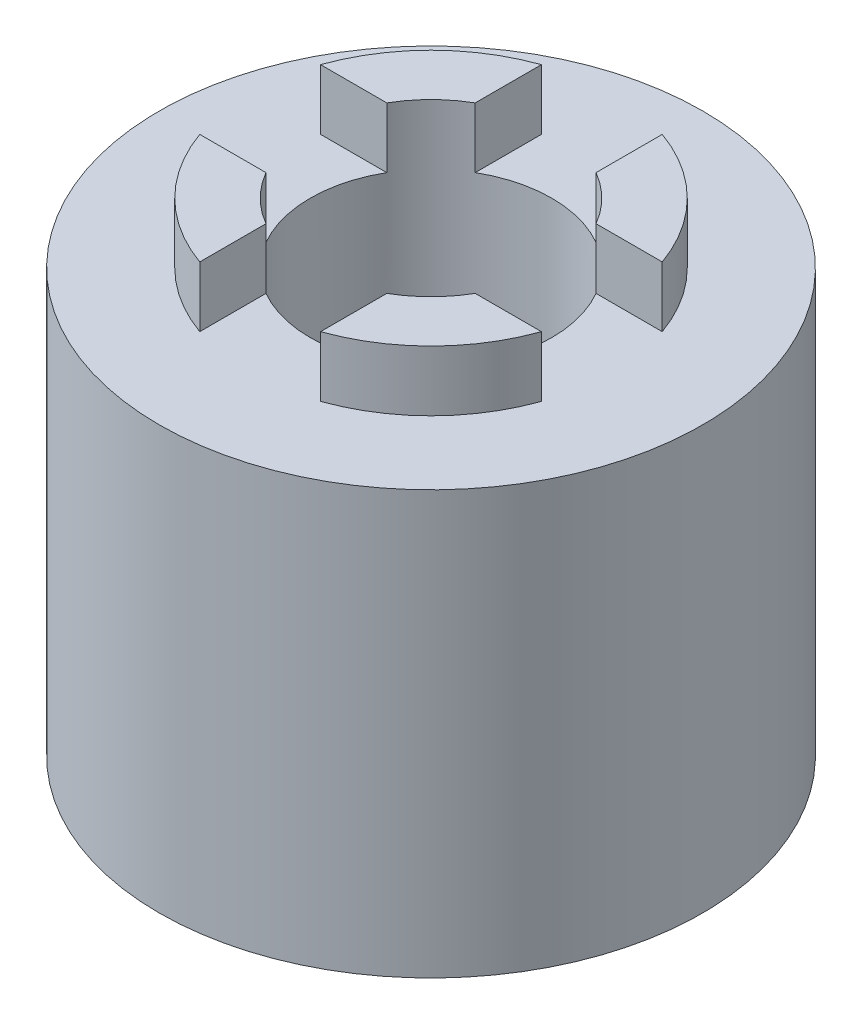
ISO-10303-21;
HEADER;
FILE_DESCRIPTION(('STEP AP214'),'2;1');
FILE_NAME('part.step','',(''),(''),'','','');
FILE_SCHEMA(('AUTOMOTIVE_DESIGN { 1 0 10303 214 1 1 1 1 }'));
ENDSEC;
DATA;
#1=APPLICATION_CONTEXT('core data for automotive mechanical design processes');
#2=APPLICATION_PROTOCOL_DEFINITION('international standard','automotive_design',2000,#1);
#3=PRODUCT_CONTEXT('',#1,'mechanical');
#4=PRODUCT('Part','Part','',(#3));
#5=PRODUCT_RELATED_PRODUCT_CATEGORY('part','',(#4));
#6=PRODUCT_DEFINITION_FORMATION('','',#4);
#7=PRODUCT_DEFINITION_CONTEXT('part definition',#1,'design');
#8=PRODUCT_DEFINITION('design','',#6,#7);
#9=PRODUCT_DEFINITION_SHAPE('','',#8);
#10=(LENGTH_UNIT() NAMED_UNIT(*) SI_UNIT(.MILLI.,.METRE.));
#11=(NAMED_UNIT(*) PLANE_ANGLE_UNIT() SI_UNIT($,.RADIAN.));
#12=(NAMED_UNIT(*) SI_UNIT($,.STERADIAN.) SOLID_ANGLE_UNIT());
#13=UNCERTAINTY_MEASURE_WITH_UNIT(LENGTH_MEASURE(1.E-05),#10,'distance_accuracy_value','');
#14=(GEOMETRIC_REPRESENTATION_CONTEXT(3) GLOBAL_UNCERTAINTY_ASSIGNED_CONTEXT((#13)) GLOBAL_UNIT_ASSIGNED_CONTEXT((#10,
#11,#12)) REPRESENTATION_CONTEXT('',''));
#15=CARTESIAN_POINT('',(0.,0.,0.));
#16=DIRECTION('',(0.,0.,1.));
#17=DIRECTION('',(1.,0.,0.));
#18=AXIS2_PLACEMENT_3D('',#15,#16,#17);
#19=CARTESIAN_POINT('',(0.,50.8,0.));
#20=DIRECTION('',(0.,1.,0.));
#21=DIRECTION('',(0.,0.,1.));
#22=AXIS2_PLACEMENT_3D('',#19,#20,#21);
#23=PLANE('',#22);
#24=DIRECTION('',(0.,0.,1.));
#25=VECTOR('',#24,1.);
#26=CARTESIAN_POINT('',(-6.35000000000014,50.8,-38.0999999999998));
#27=LINE('',#26,#25);
#28=CARTESIAN_POINT('',(-6.35000000000007,50.8,-17.9605122421383));
#29=VERTEX_POINT('',#28);
#30=CARTESIAN_POINT('',(-6.35000000000005,50.8,-10.9985226280623));
#31=VERTEX_POINT('',#30);
#32=EDGE_CURVE('E184',#29,#31,#27,.T.);
#33=ORIENTED_EDGE('',*,*,#32,.F.);
#34=CARTESIAN_POINT('',(0.,50.8,0.));
#35=DIRECTION('',(0.,1.,0.));
#36=DIRECTION('',(0.,0.,1.));
#37=AXIS2_PLACEMENT_3D('',#34,#35,#36);
#38=CIRCLE('',#37,19.05);
#39=CARTESIAN_POINT('',(-17.9605122421383,50.8,-6.35));
#40=VERTEX_POINT('',#39);
#41=EDGE_CURVE('E63',#29,#40,#38,.T.);
#42=ORIENTED_EDGE('',*,*,#41,.T.);
#43=DIRECTION('',(-1.,0.,0.));
#44=VECTOR('',#43,1.);
#45=CARTESIAN_POINT('',(38.0999999999998,50.8,-6.35000000000001));
#46=LINE('',#45,#44);
#47=CARTESIAN_POINT('',(-10.9985226280624,50.8,-6.35));
#48=VERTEX_POINT('',#47);
#49=EDGE_CURVE('E207',#48,#40,#46,.T.);
#50=ORIENTED_EDGE('',*,*,#49,.F.);
#51=CARTESIAN_POINT('',(0.,50.8,0.));
#52=DIRECTION('',(0.,1.,0.));
#53=DIRECTION('',(0.,0.,1.));
#54=AXIS2_PLACEMENT_3D('',#51,#52,#53);
#55=CIRCLE('',#54,12.7);
#56=EDGE_CURVE('E217',#31,#48,#55,.T.);
#57=ORIENTED_EDGE('',*,*,#56,.F.);
#58=EDGE_LOOP('',(#33,#42,#50,#57));
#59=FACE_BOUND('',#58,.T.);
#60=ADVANCED_FACE('F39',(#59),#23,.T.);
#61=DIRECTION('',(1.,0.,0.));
#62=VECTOR('',#61,1.);
#63=CARTESIAN_POINT('',(38.0999999999998,50.8,6.34999999999999));
#64=LINE('',#63,#62);
#65=CARTESIAN_POINT('',(-17.9605122421383,50.8,6.35));
#66=VERTEX_POINT('',#65);
#67=CARTESIAN_POINT('',(-10.9985226280624,50.8,6.35));
#68=VERTEX_POINT('',#67);
#69=EDGE_CURVE('E206',#66,#68,#64,.T.);
#70=ORIENTED_EDGE('',*,*,#69,.F.);
#71=CARTESIAN_POINT('',(-6.34999999999994,50.8,17.9605122421383));
#72=VERTEX_POINT('',#71);
#73=EDGE_CURVE('E261',#66,#72,#38,.T.);
#74=ORIENTED_EDGE('',*,*,#73,.T.);
#75=CARTESIAN_POINT('',(-6.34999999999996,50.8,10.9985226280624));
#76=VERTEX_POINT('',#75);
#77=EDGE_CURVE('E193',#76,#72,#27,.T.);
#78=ORIENTED_EDGE('',*,*,#77,.F.);
#79=EDGE_CURVE('E214',#68,#76,#55,.T.);
#80=ORIENTED_EDGE('',*,*,#79,.F.);
#81=EDGE_LOOP('',(#70,#74,#78,#80));
#82=FACE_BOUND('',#81,.T.);
#83=ADVANCED_FACE('F259',(#82),#23,.T.);
#84=CARTESIAN_POINT('',(17.9605122421383,50.8,-6.35000000000001));
#85=VERTEX_POINT('',#84);
#86=CARTESIAN_POINT('',(10.9985226280624,50.8,-6.35000000000001));
#87=VERTEX_POINT('',#86);
#88=EDGE_CURVE('E198',#85,#87,#46,.T.);
#89=ORIENTED_EDGE('',*,*,#88,.F.);
#90=CARTESIAN_POINT('',(6.34999999999993,50.8,-17.9605122421383));
#91=VERTEX_POINT('',#90);
#92=EDGE_CURVE('E265',#85,#91,#38,.T.);
#93=ORIENTED_EDGE('',*,*,#92,.T.);
#94=DIRECTION('',(0.,0.,-1.));
#95=VECTOR('',#94,1.);
#96=CARTESIAN_POINT('',(6.34999999999985,50.8,-38.0999999999999));
#97=LINE('',#96,#95);
#98=CARTESIAN_POINT('',(6.34999999999995,50.8,-10.9985226280624));
#99=VERTEX_POINT('',#98);
#100=EDGE_CURVE('E189',#99,#91,#97,.T.);
#101=ORIENTED_EDGE('',*,*,#100,.F.);
#102=EDGE_CURVE('E218',#87,#99,#55,.T.);
#103=ORIENTED_EDGE('',*,*,#102,.F.);
#104=EDGE_LOOP('',(#89,#93,#101,#103));
#105=FACE_BOUND('',#104,.T.);
#106=ADVANCED_FACE('F273',(#105),#23,.T.);
#107=CARTESIAN_POINT('',(6.35000000000006,50.8,17.9605122421383));
#108=VERTEX_POINT('',#107);
#109=CARTESIAN_POINT('',(6.35000000000004,50.8,10.9985226280624));
#110=VERTEX_POINT('',#109);
#111=EDGE_CURVE('E192',#108,#110,#97,.T.);
#112=ORIENTED_EDGE('',*,*,#111,.F.);
#113=CARTESIAN_POINT('',(17.9605122421383,50.8,6.34999999999999));
#114=VERTEX_POINT('',#113);
#115=EDGE_CURVE('E157',#108,#114,#38,.T.);
#116=ORIENTED_EDGE('',*,*,#115,.T.);
#117=CARTESIAN_POINT('',(10.9985226280624,50.8,6.34999999999999));
#118=VERTEX_POINT('',#117);
#119=EDGE_CURVE('E203',#118,#114,#64,.T.);
#120=ORIENTED_EDGE('',*,*,#119,.F.);
#121=EDGE_CURVE('E213',#110,#118,#55,.T.);
#122=ORIENTED_EDGE('',*,*,#121,.F.);
#123=EDGE_LOOP('',(#112,#116,#120,#122));
#124=FACE_BOUND('',#123,.T.);
#125=ADVANCED_FACE('F292',(#124),#23,.T.);
#126=CARTESIAN_POINT('',(0.,50.8,0.));
#127=DIRECTION('',(0.,-1.,0.));
#128=DIRECTION('',(0.,0.,-1.));
#129=AXIS2_PLACEMENT_3D('',#126,#127,#128);
#130=CYLINDRICAL_SURFACE('',#129,28.575);
#131=CARTESIAN_POINT('',(0.,0.,0.));
#132=DIRECTION('',(0.,1.,0.));
#133=DIRECTION('',(0.,0.,1.));
#134=AXIS2_PLACEMENT_3D('',#131,#132,#133);
#135=CIRCLE('',#134,28.575);
#136=CARTESIAN_POINT('',(0.,0.,28.575));
#137=VERTEX_POINT('',#136);
#138=EDGE_CURVE('E219',#137,#137,#135,.T.);
#139=ORIENTED_EDGE('',*,*,#138,.T.);
#140=EDGE_LOOP('',(#139));
#141=FACE_BOUND('',#140,.T.);
#142=CARTESIAN_POINT('',(0.,44.45,0.));
#143=DIRECTION('',(0.,-1.,0.));
#144=DIRECTION('',(0.,0.,-1.));
#145=AXIS2_PLACEMENT_3D('',#142,#143,#144);
#146=CIRCLE('',#145,28.575);
#147=CARTESIAN_POINT('',(0.,44.45,-28.575));
#148=VERTEX_POINT('',#147);
#149=EDGE_CURVE('E210',#148,#148,#146,.T.);
#150=ORIENTED_EDGE('',*,*,#149,.T.);
#151=EDGE_LOOP('',(#150));
#152=FACE_BOUND('',#151,.T.);
#153=ADVANCED_FACE('F41',(#141,#152),#130,.T.);
#154=CARTESIAN_POINT('',(38.0999999999998,44.45,6.34999999999999));
#155=DIRECTION('',(0.,0.,1.));
#156=DIRECTION('',(1.,0.,0.));
#157=AXIS2_PLACEMENT_3D('',#154,#155,#156);
#158=PLANE('',#157);
#159=DIRECTION('',(0.,1.,0.));
#160=VECTOR('',#159,1.);
#161=CARTESIAN_POINT('',(-17.9605122421383,44.45,6.35));
#162=LINE('',#161,#160);
#163=CARTESIAN_POINT('',(-17.9605122421383,44.45,6.35));
#164=VERTEX_POINT('',#163);
#165=EDGE_CURVE('E324',#66,#164,#162,.F.);
#166=ORIENTED_EDGE('',*,*,#165,.F.);
#167=ORIENTED_EDGE('',*,*,#69,.T.);
#168=DIRECTION('',(0.,-1.,0.));
#169=VECTOR('',#168,1.);
#170=CARTESIAN_POINT('',(-10.9985226280624,50.8,6.35));
#171=LINE('',#170,#169);
#172=CARTESIAN_POINT('',(-10.9985226280624,44.45,6.35));
#173=VERTEX_POINT('',#172);
#174=EDGE_CURVE('E224',#68,#173,#171,.T.);
#175=ORIENTED_EDGE('',*,*,#174,.T.);
#176=DIRECTION('',(1.,0.,0.));
#177=VECTOR('',#176,1.);
#178=CARTESIAN_POINT('',(38.0999999999998,44.45,6.34999999999999));
#179=LINE('',#178,#177);
#180=EDGE_CURVE('E197',#164,#173,#179,.T.);
#181=ORIENTED_EDGE('',*,*,#180,.F.);
#182=EDGE_LOOP('',(#166,#167,#175,#181));
#183=FACE_BOUND('',#182,.T.);
#184=ADVANCED_FACE('F299',(#183),#158,.F.);
#185=CARTESIAN_POINT('',(38.0999999999998,44.45,-6.35000000000001));
#186=DIRECTION('',(0.,0.,-1.));
#187=DIRECTION('',(-1.,0.,0.));
#188=AXIS2_PLACEMENT_3D('',#185,#186,#187);
#189=PLANE('',#188);
#190=DIRECTION('',(0.,1.,0.));
#191=VECTOR('',#190,1.);
#192=CARTESIAN_POINT('',(-17.9605122421383,44.45,-6.35));
#193=LINE('',#192,#191);
#194=CARTESIAN_POINT('',(-17.9605122421383,44.45,-6.35));
#195=VERTEX_POINT('',#194);
#196=EDGE_CURVE('E322',#195,#40,#193,.T.);
#197=ORIENTED_EDGE('',*,*,#196,.F.);
#198=DIRECTION('',(-1.,0.,0.));
#199=VECTOR('',#198,1.);
#200=CARTESIAN_POINT('',(38.0999999999998,44.45,-6.35000000000001));
#201=LINE('',#200,#199);
#202=CARTESIAN_POINT('',(-10.9985226280624,44.45,-6.35));
#203=VERTEX_POINT('',#202);
#204=EDGE_CURVE('E199',#203,#195,#201,.T.);
#205=ORIENTED_EDGE('',*,*,#204,.F.);
#206=DIRECTION('',(0.,-1.,0.));
#207=VECTOR('',#206,1.);
#208=CARTESIAN_POINT('',(-10.9985226280624,50.8,-6.35));
#209=LINE('',#208,#207);
#210=EDGE_CURVE('E228',#203,#48,#209,.F.);
#211=ORIENTED_EDGE('',*,*,#210,.T.);
#212=ORIENTED_EDGE('',*,*,#49,.T.);
#213=EDGE_LOOP('',(#197,#205,#211,#212));
#214=FACE_BOUND('',#213,.T.);
#215=ADVANCED_FACE('F352',(#214),#189,.F.);
#216=DIRECTION('',(0.,1.,0.));
#217=VECTOR('',#216,1.);
#218=CARTESIAN_POINT('',(17.9605122421383,44.45,-6.35000000000001));
#219=LINE('',#218,#217);
#220=CARTESIAN_POINT('',(17.9605122421383,44.45,-6.35000000000001));
#221=VERTEX_POINT('',#220);
#222=EDGE_CURVE('E320',#85,#221,#219,.F.);
#223=ORIENTED_EDGE('',*,*,#222,.F.);
#224=ORIENTED_EDGE('',*,*,#88,.T.);
#225=DIRECTION('',(0.,-1.,0.));
#226=VECTOR('',#225,1.);
#227=CARTESIAN_POINT('',(10.9985226280624,50.8,-6.35000000000001));
#228=LINE('',#227,#226);
#229=CARTESIAN_POINT('',(10.9985226280624,44.45,-6.35000000000001));
#230=VERTEX_POINT('',#229);
#231=EDGE_CURVE('E234',#87,#230,#228,.T.);
#232=ORIENTED_EDGE('',*,*,#231,.T.);
#233=EDGE_CURVE('E202',#221,#230,#201,.T.);
#234=ORIENTED_EDGE('',*,*,#233,.F.);
#235=EDGE_LOOP('',(#223,#224,#232,#234));
#236=FACE_BOUND('',#235,.T.);
#237=ADVANCED_FACE('F355',(#236),#189,.F.);
#238=DIRECTION('',(0.,1.,0.));
#239=VECTOR('',#238,1.);
#240=CARTESIAN_POINT('',(17.9605122421383,44.45,6.34999999999999));
#241=LINE('',#240,#239);
#242=CARTESIAN_POINT('',(17.9605122421383,44.45,6.34999999999999));
#243=VERTEX_POINT('',#242);
#244=EDGE_CURVE('E315',#243,#114,#241,.T.);
#245=ORIENTED_EDGE('',*,*,#244,.F.);
#246=CARTESIAN_POINT('',(10.9985226280624,44.45,6.34999999999999));
#247=VERTEX_POINT('',#246);
#248=EDGE_CURVE('E171',#247,#243,#179,.T.);
#249=ORIENTED_EDGE('',*,*,#248,.F.);
#250=DIRECTION('',(0.,-1.,0.));
#251=VECTOR('',#250,1.);
#252=CARTESIAN_POINT('',(10.9985226280624,50.8,6.34999999999999));
#253=LINE('',#252,#251);
#254=EDGE_CURVE('E231',#247,#118,#253,.F.);
#255=ORIENTED_EDGE('',*,*,#254,.T.);
#256=ORIENTED_EDGE('',*,*,#119,.T.);
#257=EDGE_LOOP('',(#245,#249,#255,#256));
#258=FACE_BOUND('',#257,.T.);
#259=ADVANCED_FACE('F291',(#258),#158,.F.);
#260=CARTESIAN_POINT('',(6.34999999999985,44.45,-38.0999999999999));
#261=DIRECTION('',(1.,0.,0.));
#262=DIRECTION('',(0.,0.,-1.));
#263=AXIS2_PLACEMENT_3D('',#260,#261,#262);
#264=PLANE('',#263);
#265=DIRECTION('',(0.,1.,0.));
#266=VECTOR('',#265,1.);
#267=CARTESIAN_POINT('',(6.34999999999993,44.45,-17.9605122421383));
#268=LINE('',#267,#266);
#269=CARTESIAN_POINT('',(6.34999999999993,44.45,-17.9605122421383));
#270=VERTEX_POINT('',#269);
#271=EDGE_CURVE('E280',#270,#91,#268,.T.);
#272=ORIENTED_EDGE('',*,*,#271,.F.);
#273=DIRECTION('',(0.,0.,-1.));
#274=VECTOR('',#273,1.);
#275=CARTESIAN_POINT('',(6.34999999999985,44.45,-38.0999999999999));
#276=LINE('',#275,#274);
#277=CARTESIAN_POINT('',(6.34999999999995,44.45,-10.9985226280624));
#278=VERTEX_POINT('',#277);
#279=EDGE_CURVE('E178',#278,#270,#276,.T.);
#280=ORIENTED_EDGE('',*,*,#279,.F.);
#281=DIRECTION('',(0.,-1.,0.));
#282=VECTOR('',#281,1.);
#283=CARTESIAN_POINT('',(6.34999999999995,50.8,-10.9985226280624));
#284=LINE('',#283,#282);
#285=EDGE_CURVE('E239',#278,#99,#284,.F.);
#286=ORIENTED_EDGE('',*,*,#285,.T.);
#287=ORIENTED_EDGE('',*,*,#100,.T.);
#288=EDGE_LOOP('',(#272,#280,#286,#287));
#289=FACE_BOUND('',#288,.T.);
#290=ADVANCED_FACE('F278',(#289),#264,.F.);
#291=CARTESIAN_POINT('',(-6.35000000000014,44.45,-38.0999999999998));
#292=DIRECTION('',(-1.,0.,0.));
#293=DIRECTION('',(0.,0.,1.));
#294=AXIS2_PLACEMENT_3D('',#291,#292,#293);
#295=PLANE('',#294);
#296=DIRECTION('',(0.,1.,0.));
#297=VECTOR('',#296,1.);
#298=CARTESIAN_POINT('',(-6.35000000000007,44.45,-17.9605122421383));
#299=LINE('',#298,#297);
#300=CARTESIAN_POINT('',(-6.35000000000007,44.45,-17.9605122421383));
#301=VERTEX_POINT('',#300);
#302=EDGE_CURVE('E312',#29,#301,#299,.F.);
#303=ORIENTED_EDGE('',*,*,#302,.F.);
#304=ORIENTED_EDGE('',*,*,#32,.T.);
#305=DIRECTION('',(0.,-1.,0.));
#306=VECTOR('',#305,1.);
#307=CARTESIAN_POINT('',(-6.35000000000005,50.8,-10.9985226280623));
#308=LINE('',#307,#306);
#309=CARTESIAN_POINT('',(-6.35000000000005,44.45,-10.9985226280623));
#310=VERTEX_POINT('',#309);
#311=EDGE_CURVE('E242',#31,#310,#308,.T.);
#312=ORIENTED_EDGE('',*,*,#311,.T.);
#313=DIRECTION('',(0.,0.,1.));
#314=VECTOR('',#313,1.);
#315=CARTESIAN_POINT('',(-6.35000000000014,44.45,-38.0999999999998));
#316=LINE('',#315,#314);
#317=EDGE_CURVE('E181',#301,#310,#316,.T.);
#318=ORIENTED_EDGE('',*,*,#317,.F.);
#319=EDGE_LOOP('',(#303,#304,#312,#318));
#320=FACE_BOUND('',#319,.T.);
#321=ADVANCED_FACE('F310',(#320),#295,.F.);
#322=DIRECTION('',(0.,1.,0.));
#323=VECTOR('',#322,1.);
#324=CARTESIAN_POINT('',(-6.34999999999994,44.45,17.9605122421383));
#325=LINE('',#324,#323);
#326=CARTESIAN_POINT('',(-6.34999999999994,44.45,17.9605122421383));
#327=VERTEX_POINT('',#326);
#328=EDGE_CURVE('E161',#327,#72,#325,.T.);
#329=ORIENTED_EDGE('',*,*,#328,.F.);
#330=CARTESIAN_POINT('',(-6.34999999999996,44.45,10.9985226280624));
#331=VERTEX_POINT('',#330);
#332=EDGE_CURVE('E177',#331,#327,#316,.T.);
#333=ORIENTED_EDGE('',*,*,#332,.F.);
#334=DIRECTION('',(0.,-1.,0.));
#335=VECTOR('',#334,1.);
#336=CARTESIAN_POINT('',(-6.34999999999996,50.8,10.9985226280624));
#337=LINE('',#336,#335);
#338=EDGE_CURVE('E12',#331,#76,#337,.F.);
#339=ORIENTED_EDGE('',*,*,#338,.T.);
#340=ORIENTED_EDGE('',*,*,#77,.T.);
#341=EDGE_LOOP('',(#329,#333,#339,#340));
#342=FACE_BOUND('',#341,.T.);
#343=ADVANCED_FACE('F250',(#342),#295,.F.);
#344=DIRECTION('',(0.,1.,0.));
#345=VECTOR('',#344,1.);
#346=CARTESIAN_POINT('',(6.35000000000006,44.45,17.9605122421383));
#347=LINE('',#346,#345);
#348=CARTESIAN_POINT('',(6.35000000000006,44.45,17.9605122421383));
#349=VERTEX_POINT('',#348);
#350=EDGE_CURVE('E151',#108,#349,#347,.F.);
#351=ORIENTED_EDGE('',*,*,#350,.F.);
#352=ORIENTED_EDGE('',*,*,#111,.T.);
#353=DIRECTION('',(0.,-1.,0.));
#354=VECTOR('',#353,1.);
#355=CARTESIAN_POINT('',(6.35000000000004,50.8,10.9985226280624));
#356=LINE('',#355,#354);
#357=CARTESIAN_POINT('',(6.35000000000004,44.45,10.9985226280624));
#358=VERTEX_POINT('',#357);
#359=EDGE_CURVE('E48',#110,#358,#356,.T.);
#360=ORIENTED_EDGE('',*,*,#359,.T.);
#361=EDGE_CURVE('E168',#349,#358,#276,.T.);
#362=ORIENTED_EDGE('',*,*,#361,.F.);
#363=EDGE_LOOP('',(#351,#352,#360,#362));
#364=FACE_BOUND('',#363,.T.);
#365=ADVANCED_FACE('F174',(#364),#264,.F.);
#366=CARTESIAN_POINT('',(0.,50.8,0.));
#367=DIRECTION('',(0.,-1.,0.));
#368=DIRECTION('',(0.,0.,-1.));
#369=AXIS2_PLACEMENT_3D('',#366,#367,#368);
#370=CYLINDRICAL_SURFACE('',#369,12.7);
#371=ORIENTED_EDGE('',*,*,#338,.F.);
#372=CARTESIAN_POINT('',(0.,44.45,0.));
#373=DIRECTION('',(0.,-1.,0.));
#374=DIRECTION('',(0.,0.,-1.));
#375=AXIS2_PLACEMENT_3D('',#372,#373,#374);
#376=CIRCLE('',#375,12.7);
#377=EDGE_CURVE('E240',#358,#331,#376,.T.);
#378=ORIENTED_EDGE('',*,*,#377,.F.);
#379=ORIENTED_EDGE('',*,*,#359,.F.);
#380=ORIENTED_EDGE('',*,*,#121,.T.);
#381=ORIENTED_EDGE('',*,*,#254,.F.);
#382=CARTESIAN_POINT('',(0.,44.45,0.));
#383=DIRECTION('',(0.,-1.,0.));
#384=DIRECTION('',(0.,0.,-1.));
#385=AXIS2_PLACEMENT_3D('',#382,#383,#384);
#386=CIRCLE('',#385,12.7);
#387=EDGE_CURVE('E225',#230,#247,#386,.T.);
#388=ORIENTED_EDGE('',*,*,#387,.F.);
#389=ORIENTED_EDGE('',*,*,#231,.F.);
#390=ORIENTED_EDGE('',*,*,#102,.T.);
#391=ORIENTED_EDGE('',*,*,#285,.F.);
#392=EDGE_CURVE('E237',#310,#278,#376,.T.);
#393=ORIENTED_EDGE('',*,*,#392,.F.);
#394=ORIENTED_EDGE('',*,*,#311,.F.);
#395=ORIENTED_EDGE('',*,*,#56,.T.);
#396=ORIENTED_EDGE('',*,*,#210,.F.);
#397=EDGE_CURVE('E222',#173,#203,#386,.T.);
#398=ORIENTED_EDGE('',*,*,#397,.F.);
#399=ORIENTED_EDGE('',*,*,#174,.F.);
#400=ORIENTED_EDGE('',*,*,#79,.T.);
#401=EDGE_LOOP('',(#371,#378,#379,#380,#381,#388,#389,#390,#391,#393,#394,#395,#396,#398,#399,#400));
#402=FACE_BOUND('',#401,.T.);
#403=CARTESIAN_POINT('',(0.,25.4,0.));
#404=DIRECTION('',(0.,-1.,0.));
#405=DIRECTION('',(0.,0.,-1.));
#406=AXIS2_PLACEMENT_3D('',#403,#404,#405);
#407=CIRCLE('',#406,12.7);
#408=CARTESIAN_POINT('',(0.,25.4,-12.7));
#409=VERTEX_POINT('',#408);
#410=EDGE_CURVE('E43',#409,#409,#407,.T.);
#411=ORIENTED_EDGE('',*,*,#410,.T.);
#412=EDGE_LOOP('',(#411));
#413=FACE_BOUND('',#412,.T.);
#414=ADVANCED_FACE('F252',(#402,#413),#370,.F.);
#415=CARTESIAN_POINT('',(0.,0.,0.));
#416=DIRECTION('',(0.,1.,0.));
#417=DIRECTION('',(0.,0.,1.));
#418=AXIS2_PLACEMENT_3D('',#415,#416,#417);
#419=PLANE('',#418);
#420=CARTESIAN_POINT('',(0.,0.,0.));
#421=DIRECTION('',(0.,-1.,0.));
#422=DIRECTION('',(0.,0.,-1.));
#423=AXIS2_PLACEMENT_3D('',#420,#421,#422);
#424=CIRCLE('',#423,22.225);
#425=CARTESIAN_POINT('',(0.,0.,-22.225));
#426=VERTEX_POINT('',#425);
#427=EDGE_CURVE('E186',#426,#426,#424,.T.);
#428=ORIENTED_EDGE('',*,*,#427,.F.);
#429=EDGE_LOOP('',(#428));
#430=FACE_BOUND('',#429,.T.);
#431=ORIENTED_EDGE('',*,*,#138,.F.);
#432=EDGE_LOOP('',(#431));
#433=FACE_BOUND('',#432,.T.);
#434=ADVANCED_FACE('F335',(#430,#433),#419,.F.);
#435=CARTESIAN_POINT('',(0.,44.45,0.));
#436=DIRECTION('',(0.,-1.,0.));
#437=DIRECTION('',(0.,0.,-1.));
#438=AXIS2_PLACEMENT_3D('',#435,#436,#437);
#439=PLANE('',#438);
#440=CARTESIAN_POINT('',(0.,44.45,0.));
#441=DIRECTION('',(0.,1.,0.));
#442=DIRECTION('',(0.,0.,1.));
#443=AXIS2_PLACEMENT_3D('',#440,#441,#442);
#444=CIRCLE('',#443,19.05);
#445=EDGE_CURVE('E173',#164,#327,#444,.T.);
#446=ORIENTED_EDGE('',*,*,#445,.F.);
#447=ORIENTED_EDGE('',*,*,#180,.T.);
#448=ORIENTED_EDGE('',*,*,#397,.T.);
#449=ORIENTED_EDGE('',*,*,#204,.T.);
#450=EDGE_CURVE('E268',#301,#195,#444,.T.);
#451=ORIENTED_EDGE('',*,*,#450,.F.);
#452=ORIENTED_EDGE('',*,*,#317,.T.);
#453=ORIENTED_EDGE('',*,*,#392,.T.);
#454=ORIENTED_EDGE('',*,*,#279,.T.);
#455=EDGE_CURVE('E55',#221,#270,#444,.T.);
#456=ORIENTED_EDGE('',*,*,#455,.F.);
#457=ORIENTED_EDGE('',*,*,#233,.T.);
#458=ORIENTED_EDGE('',*,*,#387,.T.);
#459=ORIENTED_EDGE('',*,*,#248,.T.);
#460=EDGE_CURVE('E154',#349,#243,#444,.T.);
#461=ORIENTED_EDGE('',*,*,#460,.F.);
#462=ORIENTED_EDGE('',*,*,#361,.T.);
#463=ORIENTED_EDGE('',*,*,#377,.T.);
#464=ORIENTED_EDGE('',*,*,#332,.T.);
#465=EDGE_LOOP('',(#446,#447,#448,#449,#451,#452,#453,#454,#456,#457,#458,#459,#461,#462,#463,#464));
#466=FACE_BOUND('',#465,.T.);
#467=ORIENTED_EDGE('',*,*,#149,.F.);
#468=EDGE_LOOP('',(#467));
#469=FACE_BOUND('',#468,.T.);
#470=ADVANCED_FACE('F166',(#466,#469),#439,.F.);
#471=CARTESIAN_POINT('',(0.,25.4,0.));
#472=DIRECTION('',(0.,-1.,0.));
#473=DIRECTION('',(0.,0.,-1.));
#474=AXIS2_PLACEMENT_3D('',#471,#472,#473);
#475=CYLINDRICAL_SURFACE('',#474,22.225);
#476=CARTESIAN_POINT('',(0.,25.4,0.));
#477=DIRECTION('',(0.,-1.,0.));
#478=DIRECTION('',(0.,0.,-1.));
#479=AXIS2_PLACEMENT_3D('',#476,#477,#478);
#480=CIRCLE('',#479,22.225);
#481=CARTESIAN_POINT('',(0.,25.4,-22.225));
#482=VERTEX_POINT('',#481);
#483=EDGE_CURVE('E325',#482,#482,#480,.T.);
#484=CARTESIAN_POINT('',(0.,25.4,-22.225));
#485=CARTESIAN_POINT('',(0.,25.1354166666667,-22.225));
#486=CARTESIAN_POINT('',(0.,24.8708333333334,-22.225));
#487=CARTESIAN_POINT('',(0.,24.3416666666667,-22.225));
#488=CARTESIAN_POINT('',(0.,24.0770833333334,-22.225));
#489=CARTESIAN_POINT('',(0.,23.5479166666667,-22.225));
#490=CARTESIAN_POINT('',(0.,23.2833333333334,-22.225));
#491=CARTESIAN_POINT('',(0.,22.7541666666667,-22.225));
#492=CARTESIAN_POINT('',(0.,22.4895833333334,-22.225));
#493=CARTESIAN_POINT('',(0.,21.9604166666667,-22.225));
#494=CARTESIAN_POINT('',(0.,21.6958333333334,-22.225));
#495=CARTESIAN_POINT('',(0.,21.1666666666667,-22.225));
#496=CARTESIAN_POINT('',(0.,20.9020833333334,-22.225));
#497=CARTESIAN_POINT('',(0.,20.3729166666667,-22.225));
#498=CARTESIAN_POINT('',(0.,20.1083333333334,-22.225));
#499=CARTESIAN_POINT('',(0.,19.5791666666667,-22.225));
#500=CARTESIAN_POINT('',(0.,19.3145833333334,-22.225));
#501=CARTESIAN_POINT('',(0.,18.7854166666667,-22.225));
#502=CARTESIAN_POINT('',(0.,18.5208333333334,-22.225));
#503=CARTESIAN_POINT('',(0.,17.9916666666667,-22.225));
#504=CARTESIAN_POINT('',(0.,17.7270833333334,-22.225));
#505=CARTESIAN_POINT('',(0.,17.1979166666667,-22.225));
#506=CARTESIAN_POINT('',(0.,16.9333333333334,-22.225));
#507=CARTESIAN_POINT('',(0.,16.4041666666667,-22.225));
#508=CARTESIAN_POINT('',(0.,16.1395833333334,-22.225));
#509=CARTESIAN_POINT('',(0.,15.6104166666667,-22.225));
#510=CARTESIAN_POINT('',(0.,15.3458333333334,-22.225));
#511=CARTESIAN_POINT('',(0.,14.8166666666667,-22.225));
#512=CARTESIAN_POINT('',(0.,14.5520833333334,-22.225));
#513=CARTESIAN_POINT('',(0.,14.0229166666667,-22.225));
#514=CARTESIAN_POINT('',(0.,13.7583333333334,-22.225));
#515=CARTESIAN_POINT('',(0.,13.2291666666667,-22.225));
#516=CARTESIAN_POINT('',(0.,12.9645833333334,-22.225));
#517=CARTESIAN_POINT('',(0.,12.4354166666667,-22.225));
#518=CARTESIAN_POINT('',(0.,12.1708333333334,-22.225));
#519=CARTESIAN_POINT('',(0.,11.6416666666667,-22.225));
#520=CARTESIAN_POINT('',(0.,11.3770833333334,-22.225));
#521=CARTESIAN_POINT('',(0.,10.8479166666667,-22.225));
#522=CARTESIAN_POINT('',(0.,10.5833333333334,-22.225));
#523=CARTESIAN_POINT('',(0.,10.0541666666667,-22.225));
#524=CARTESIAN_POINT('',(0.,9.78958333333335,-22.225));
#525=CARTESIAN_POINT('',(0.,9.26041666666668,-22.225));
#526=CARTESIAN_POINT('',(0.,8.99583333333335,-22.225));
#527=CARTESIAN_POINT('',(0.,8.46666666666668,-22.225));
#528=CARTESIAN_POINT('',(0.,8.20208333333335,-22.225));
#529=CARTESIAN_POINT('',(0.,7.67291666666668,-22.225));
#530=CARTESIAN_POINT('',(0.,7.40833333333335,-22.225));
#531=CARTESIAN_POINT('',(0.,6.87916666666668,-22.225));
#532=CARTESIAN_POINT('',(0.,6.61458333333335,-22.225));
#533=CARTESIAN_POINT('',(0.,6.08541666666668,-22.225));
#534=CARTESIAN_POINT('',(0.,5.82083333333334,-22.225));
#535=CARTESIAN_POINT('',(0.,5.29166666666668,-22.225));
#536=CARTESIAN_POINT('',(0.,5.02708333333334,-22.225));
#537=CARTESIAN_POINT('',(0.,4.49791666666668,-22.225));
#538=CARTESIAN_POINT('',(0.,4.23333333333334,-22.225));
#539=CARTESIAN_POINT('',(0.,3.70416666666668,-22.225));
#540=CARTESIAN_POINT('',(0.,3.43958333333334,-22.225));
#541=CARTESIAN_POINT('',(0.,2.91041666666667,-22.225));
#542=CARTESIAN_POINT('',(0.,2.64583333333334,-22.225));
#543=CARTESIAN_POINT('',(0.,2.11666666666667,-22.225));
#544=CARTESIAN_POINT('',(0.,1.85208333333334,-22.225));
#545=CARTESIAN_POINT('',(0.,1.32291666666667,-22.225));
#546=CARTESIAN_POINT('',(0.,1.05833333333334,-22.225));
#547=CARTESIAN_POINT('',(0.,0.529166666666672,-22.225));
#548=CARTESIAN_POINT('',(0.,0.264583333333337,-22.225));
#549=CARTESIAN_POINT('',(0.,0.,-22.225));
#550=B_SPLINE_CURVE_WITH_KNOTS('',3,(#484,#485,#486,#487,#488,#489,#490,#491,#492,#493,#494,
#495,#496,#497,#498,#499,#500,#501,#502,#503,#504,#505,#506,#507,#508,#509,#510,#511,#512,#513,
#514,#515,#516,#517,#518,#519,#520,#521,#522,#523,#524,#525,#526,#527,#528,#529,#530,#531,#532,
#533,#534,#535,#536,#537,#538,#539,#540,#541,#542,#543,#544,#545,#546,#547,#548,#549),
.UNSPECIFIED.,.F.,.F.,(4,2,2,2,2,2,2,2,2,2,2,2,2,2,2,2,2,2,2,2,2,2,2,2,2,2,2,2,2,2,2,2,4),(0.,
0.793749999999999,1.5875,2.38125,3.175,3.96875,4.7625,5.55625000000001,6.35,7.14375000000001,
7.93750000000001,8.73125000000001,9.52500000000001,10.31875,11.1125,11.90625,12.7,13.49375,
14.2875,15.08125,15.875,16.66875,17.4625,18.25625,19.05,19.84375,20.6375,21.43125,22.225,
23.01875,23.8125,24.60625,25.4),.UNSPECIFIED.);
#551=EDGE_CURVE('BSEAM333',#482,#426,#550,.T.);
#552=ORIENTED_EDGE('',*,*,#483,.F.);
#553=ORIENTED_EDGE('',*,*,#427,.T.);
#554=ORIENTED_EDGE('',*,*,#551,.T.);
#555=ORIENTED_EDGE('',*,*,#551,.F.);
#556=EDGE_LOOP('',(#552,#554,#553,#555));
#557=FACE_BOUND('',#556,.T.);
#558=ADVANCED_FACE('F333',(#557),#475,.F.);
#559=CARTESIAN_POINT('',(0.,25.4,0.));
#560=DIRECTION('',(0.,-1.,0.));
#561=DIRECTION('',(0.,0.,-1.));
#562=AXIS2_PLACEMENT_3D('',#559,#560,#561);
#563=PLANE('',#562);
#564=ORIENTED_EDGE('',*,*,#410,.F.);
#565=EDGE_LOOP('',(#564));
#566=FACE_BOUND('',#565,.T.);
#567=ORIENTED_EDGE('',*,*,#483,.T.);
#568=EDGE_LOOP('',(#567));
#569=FACE_BOUND('',#568,.T.);
#570=ADVANCED_FACE('F346',(#566,#569),#563,.T.);
#571=CARTESIAN_POINT('',(0.,44.45,0.));
#572=DIRECTION('',(0.,1.,0.));
#573=DIRECTION('',(0.,0.,1.));
#574=AXIS2_PLACEMENT_3D('',#571,#572,#573);
#575=CYLINDRICAL_SURFACE('',#574,19.05);
#576=ORIENTED_EDGE('',*,*,#244,.T.);
#577=ORIENTED_EDGE('',*,*,#115,.F.);
#578=ORIENTED_EDGE('',*,*,#350,.T.);
#579=ORIENTED_EDGE('',*,*,#460,.T.);
#580=EDGE_LOOP('',(#576,#577,#578,#579));
#581=FACE_BOUND('',#580,.T.);
#582=ADVANCED_FACE('F153',(#581),#575,.T.);
#583=ORIENTED_EDGE('',*,*,#165,.T.);
#584=ORIENTED_EDGE('',*,*,#445,.T.);
#585=ORIENTED_EDGE('',*,*,#328,.T.);
#586=ORIENTED_EDGE('',*,*,#73,.F.);
#587=EDGE_LOOP('',(#583,#584,#585,#586));
#588=FACE_BOUND('',#587,.T.);
#589=ADVANCED_FACE('F383',(#588),#575,.T.);
#590=ORIENTED_EDGE('',*,*,#196,.T.);
#591=ORIENTED_EDGE('',*,*,#41,.F.);
#592=ORIENTED_EDGE('',*,*,#302,.T.);
#593=ORIENTED_EDGE('',*,*,#450,.T.);
#594=EDGE_LOOP('',(#590,#591,#592,#593));
#595=FACE_BOUND('',#594,.T.);
#596=ADVANCED_FACE('F380',(#595),#575,.T.);
#597=ORIENTED_EDGE('',*,*,#222,.T.);
#598=ORIENTED_EDGE('',*,*,#455,.T.);
#599=ORIENTED_EDGE('',*,*,#271,.T.);
#600=ORIENTED_EDGE('',*,*,#92,.F.);
#601=EDGE_LOOP('',(#597,#598,#599,#600));
#602=FACE_BOUND('',#601,.T.);
#603=ADVANCED_FACE('F378',(#602),#575,.T.);
#604=CLOSED_SHELL('',(#60,#83,#106,#125,#153,#184,#215,#237,#259,#290,#321,#343,#365,#414,#434,
#470,#558,#570,#582,#589,#596,#603));
#605=MANIFOLD_SOLID_BREP('B2',#604);
#606=ADVANCED_BREP_SHAPE_REPRESENTATION('',(#18,#605),#14);
#607=SHAPE_DEFINITION_REPRESENTATION(#9,#606);
ENDSEC;
END-ISO-10303-21;
